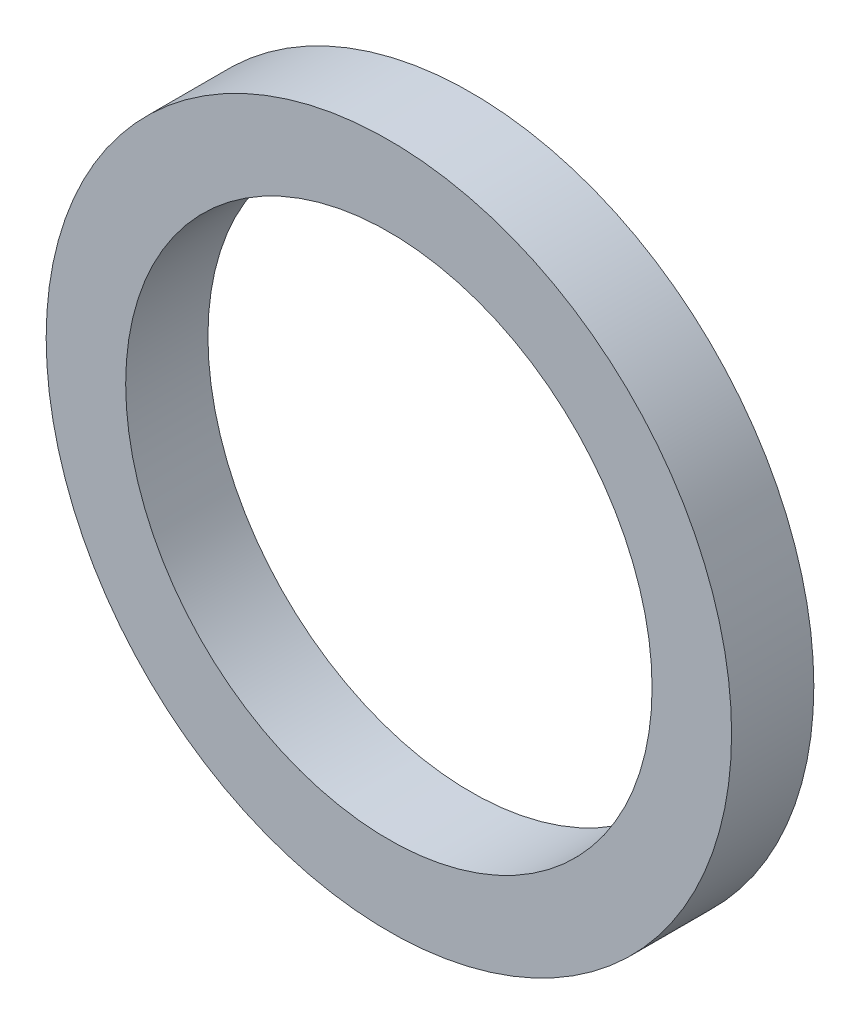
ISO-10303-21;
HEADER;
FILE_DESCRIPTION(('STEP AP214'),'2;1');
FILE_NAME('part.step','',(''),(''),'','','');
FILE_SCHEMA(('AUTOMOTIVE_DESIGN { 1 0 10303 214 1 1 1 1 }'));
ENDSEC;
DATA;
#1=APPLICATION_CONTEXT('core data for automotive mechanical design processes');
#2=APPLICATION_PROTOCOL_DEFINITION('international standard','automotive_design',2000,#1);
#3=PRODUCT_CONTEXT('',#1,'mechanical');
#4=PRODUCT('Part','Part','',(#3));
#5=PRODUCT_RELATED_PRODUCT_CATEGORY('part','',(#4));
#6=PRODUCT_DEFINITION_FORMATION('','',#4);
#7=PRODUCT_DEFINITION_CONTEXT('part definition',#1,'design');
#8=PRODUCT_DEFINITION('design','',#6,#7);
#9=PRODUCT_DEFINITION_SHAPE('','',#8);
#10=(LENGTH_UNIT() NAMED_UNIT(*) SI_UNIT(.MILLI.,.METRE.));
#11=(NAMED_UNIT(*) PLANE_ANGLE_UNIT() SI_UNIT($,.RADIAN.));
#12=(NAMED_UNIT(*) SI_UNIT($,.STERADIAN.) SOLID_ANGLE_UNIT());
#13=UNCERTAINTY_MEASURE_WITH_UNIT(LENGTH_MEASURE(1.E-05),#10,'distance_accuracy_value','');
#14=(GEOMETRIC_REPRESENTATION_CONTEXT(3) GLOBAL_UNCERTAINTY_ASSIGNED_CONTEXT((#13)) GLOBAL_UNIT_ASSIGNED_CONTEXT((#10,
#11,#12)) REPRESENTATION_CONTEXT('',''));
#15=CARTESIAN_POINT('',(0.,0.,0.));
#16=DIRECTION('',(0.,0.,1.));
#17=DIRECTION('',(1.,0.,0.));
#18=AXIS2_PLACEMENT_3D('',#15,#16,#17);
#19=CARTESIAN_POINT('',(0.,0.,7.62));
#20=DIRECTION('',(0.,0.,-1.));
#21=DIRECTION('',(-1.,0.,0.));
#22=AXIS2_PLACEMENT_3D('',#19,#20,#21);
#23=CYLINDRICAL_SURFACE('',#22,31.75);
#24=CARTESIAN_POINT('',(0.,0.,7.62));
#25=DIRECTION('',(0.,0.,1.));
#26=DIRECTION('',(1.,0.,0.));
#27=AXIS2_PLACEMENT_3D('',#24,#25,#26);
#28=CIRCLE('',#27,31.75);
#29=CARTESIAN_POINT('',(-31.75,0.,7.62));
#30=VERTEX_POINT('',#29);
#31=EDGE_CURVE('E10',#30,#30,#28,.T.);
#32=CARTESIAN_POINT('',(0.,0.,0.));
#33=DIRECTION('',(0.,0.,1.));
#34=DIRECTION('',(1.,0.,0.));
#35=AXIS2_PLACEMENT_3D('',#32,#33,#34);
#36=CIRCLE('',#35,31.75);
#37=CARTESIAN_POINT('',(-31.75,0.,0.));
#38=VERTEX_POINT('',#37);
#39=EDGE_CURVE('E34',#38,#38,#36,.T.);
#40=CARTESIAN_POINT('',(-31.75,0.,7.62));
#41=CARTESIAN_POINT('',(-31.75,0.,7.540625));
#42=CARTESIAN_POINT('',(-31.75,0.,7.46125));
#43=CARTESIAN_POINT('',(-31.75,0.,7.3025));
#44=CARTESIAN_POINT('',(-31.75,0.,7.223125));
#45=CARTESIAN_POINT('',(-31.75,0.,7.064375));
#46=CARTESIAN_POINT('',(-31.75,0.,6.985));
#47=CARTESIAN_POINT('',(-31.75,0.,6.82625));
#48=CARTESIAN_POINT('',(-31.75,0.,6.746875));
#49=CARTESIAN_POINT('',(-31.75,0.,6.588125));
#50=CARTESIAN_POINT('',(-31.75,0.,6.50875));
#51=CARTESIAN_POINT('',(-31.75,0.,6.35));
#52=CARTESIAN_POINT('',(-31.75,0.,6.270625));
#53=CARTESIAN_POINT('',(-31.75,0.,6.111875));
#54=CARTESIAN_POINT('',(-31.75,0.,6.0325));
#55=CARTESIAN_POINT('',(-31.75,0.,5.87375));
#56=CARTESIAN_POINT('',(-31.75,0.,5.794375));
#57=CARTESIAN_POINT('',(-31.75,0.,5.635625));
#58=CARTESIAN_POINT('',(-31.75,0.,5.55625));
#59=CARTESIAN_POINT('',(-31.75,0.,5.3975));
#60=CARTESIAN_POINT('',(-31.75,0.,5.318125));
#61=CARTESIAN_POINT('',(-31.75,0.,5.159375));
#62=CARTESIAN_POINT('',(-31.75,0.,5.08));
#63=CARTESIAN_POINT('',(-31.75,0.,4.92125));
#64=CARTESIAN_POINT('',(-31.75,0.,4.841875));
#65=CARTESIAN_POINT('',(-31.75,0.,4.683125));
#66=CARTESIAN_POINT('',(-31.75,0.,4.60375));
#67=CARTESIAN_POINT('',(-31.75,0.,4.445));
#68=CARTESIAN_POINT('',(-31.75,0.,4.365625));
#69=CARTESIAN_POINT('',(-31.75,0.,4.206875));
#70=CARTESIAN_POINT('',(-31.75,0.,4.1275));
#71=CARTESIAN_POINT('',(-31.75,0.,3.96875));
#72=CARTESIAN_POINT('',(-31.75,0.,3.889375));
#73=CARTESIAN_POINT('',(-31.75,0.,3.730625));
#74=CARTESIAN_POINT('',(-31.75,0.,3.65125));
#75=CARTESIAN_POINT('',(-31.75,0.,3.4925));
#76=CARTESIAN_POINT('',(-31.75,0.,3.413125));
#77=CARTESIAN_POINT('',(-31.75,0.,3.254375));
#78=CARTESIAN_POINT('',(-31.75,0.,3.175));
#79=CARTESIAN_POINT('',(-31.75,0.,3.01625));
#80=CARTESIAN_POINT('',(-31.75,0.,2.936875));
#81=CARTESIAN_POINT('',(-31.75,0.,2.778125));
#82=CARTESIAN_POINT('',(-31.75,0.,2.69875));
#83=CARTESIAN_POINT('',(-31.75,0.,2.54));
#84=CARTESIAN_POINT('',(-31.75,0.,2.460625));
#85=CARTESIAN_POINT('',(-31.75,0.,2.301875));
#86=CARTESIAN_POINT('',(-31.75,0.,2.2225));
#87=CARTESIAN_POINT('',(-31.75,0.,2.06375));
#88=CARTESIAN_POINT('',(-31.75,0.,1.984375));
#89=CARTESIAN_POINT('',(-31.75,0.,1.825625));
#90=CARTESIAN_POINT('',(-31.75,0.,1.74625));
#91=CARTESIAN_POINT('',(-31.75,0.,1.5875));
#92=CARTESIAN_POINT('',(-31.75,0.,1.508125));
#93=CARTESIAN_POINT('',(-31.75,0.,1.349375));
#94=CARTESIAN_POINT('',(-31.75,0.,1.27));
#95=CARTESIAN_POINT('',(-31.75,0.,1.11125));
#96=CARTESIAN_POINT('',(-31.75,0.,1.031875));
#97=CARTESIAN_POINT('',(-31.75,0.,0.873125));
#98=CARTESIAN_POINT('',(-31.75,0.,0.79375));
#99=CARTESIAN_POINT('',(-31.75,0.,0.635));
#100=CARTESIAN_POINT('',(-31.75,0.,0.555625));
#101=CARTESIAN_POINT('',(-31.75,0.,0.396875));
#102=CARTESIAN_POINT('',(-31.75,0.,0.3175));
#103=CARTESIAN_POINT('',(-31.75,0.,0.15875));
#104=CARTESIAN_POINT('',(-31.75,0.,0.0793749999999999));
#105=CARTESIAN_POINT('',(-31.75,0.,0.));
#106=B_SPLINE_CURVE_WITH_KNOTS('',3,(#40,#41,#42,#43,#44,#45,#46,#47,#48,#49,#50,#51,#52,#53,
#54,#55,#56,#57,#58,#59,#60,#61,#62,#63,#64,#65,#66,#67,#68,#69,#70,#71,#72,#73,#74,#75,#76,#77,
#78,#79,#80,#81,#82,#83,#84,#85,#86,#87,#88,#89,#90,#91,#92,#93,#94,#95,#96,#97,#98,#99,#100,
#101,#102,#103,#104,#105),.UNSPECIFIED.,.F.,.F.,(4,2,2,2,2,2,2,2,2,2,2,2,2,2,2,2,2,2,2,2,2,2,2,
2,2,2,2,2,2,2,2,2,4),(0.,0.238125,0.47625,0.714375000000001,0.9525,1.190625,1.42875,1.666875,
1.905,2.143125,2.38125,2.619375,2.8575,3.095625,3.33375,3.571875,3.81,4.048125,4.28625,4.524375,
4.7625,5.000625,5.23875,5.476875,5.715,5.953125,6.19125,6.429375,6.6675,6.905625,7.14375,
7.381875,7.62),.UNSPECIFIED.);
#107=EDGE_CURVE('BSEAM31',#30,#38,#106,.T.);
#108=ORIENTED_EDGE('',*,*,#31,.F.);
#109=ORIENTED_EDGE('',*,*,#39,.T.);
#110=ORIENTED_EDGE('',*,*,#107,.T.);
#111=ORIENTED_EDGE('',*,*,#107,.F.);
#112=EDGE_LOOP('',(#108,#110,#109,#111));
#113=FACE_BOUND('',#112,.T.);
#114=ADVANCED_FACE('F31',(#113),#23,.T.);
#115=CARTESIAN_POINT('',(0.,0.,7.62));
#116=DIRECTION('',(0.,0.,1.));
#117=DIRECTION('',(1.,0.,0.));
#118=AXIS2_PLACEMENT_3D('',#115,#116,#117);
#119=PLANE('',#118);
#120=CARTESIAN_POINT('',(0.,0.,7.62));
#121=DIRECTION('',(0.,0.,1.));
#122=DIRECTION('',(1.,0.,0.));
#123=AXIS2_PLACEMENT_3D('',#120,#121,#122);
#124=CIRCLE('',#123,24.384);
#125=CARTESIAN_POINT('',(24.384,0.,7.62));
#126=VERTEX_POINT('',#125);
#127=EDGE_CURVE('E43',#126,#126,#124,.T.);
#128=ORIENTED_EDGE('',*,*,#127,.F.);
#129=EDGE_LOOP('',(#128));
#130=FACE_BOUND('',#129,.T.);
#131=ORIENTED_EDGE('',*,*,#31,.T.);
#132=EDGE_LOOP('',(#131));
#133=FACE_BOUND('',#132,.T.);
#134=ADVANCED_FACE('F58',(#130,#133),#119,.T.);
#135=CARTESIAN_POINT('',(0.,0.,0.));
#136=DIRECTION('',(0.,0.,1.));
#137=DIRECTION('',(1.,0.,0.));
#138=AXIS2_PLACEMENT_3D('',#135,#136,#137);
#139=PLANE('',#138);
#140=CARTESIAN_POINT('',(0.,0.,0.));
#141=DIRECTION('',(0.,0.,1.));
#142=DIRECTION('',(1.,0.,0.));
#143=AXIS2_PLACEMENT_3D('',#140,#141,#142);
#144=CIRCLE('',#143,24.384);
#145=CARTESIAN_POINT('',(24.384,0.,0.));
#146=VERTEX_POINT('',#145);
#147=EDGE_CURVE('E41',#146,#146,#144,.T.);
#148=ORIENTED_EDGE('',*,*,#147,.T.);
#149=EDGE_LOOP('',(#148));
#150=FACE_BOUND('',#149,.T.);
#151=ORIENTED_EDGE('',*,*,#39,.F.);
#152=EDGE_LOOP('',(#151));
#153=FACE_BOUND('',#152,.T.);
#154=ADVANCED_FACE('F49',(#150,#153),#139,.F.);
#155=CARTESIAN_POINT('',(0.,0.,0.));
#156=DIRECTION('',(0.,0.,1.));
#157=DIRECTION('',(1.,0.,0.));
#158=AXIS2_PLACEMENT_3D('',#155,#156,#157);
#159=CYLINDRICAL_SURFACE('',#158,24.384);
#160=CARTESIAN_POINT('',(24.384,0.,0.));
#161=CARTESIAN_POINT('',(24.384,0.,0.0793749999999998));
#162=CARTESIAN_POINT('',(24.384,0.,0.15875));
#163=CARTESIAN_POINT('',(24.384,0.,0.3175));
#164=CARTESIAN_POINT('',(24.384,0.,0.396875));
#165=CARTESIAN_POINT('',(24.384,0.,0.555625));
#166=CARTESIAN_POINT('',(24.384,0.,0.635));
#167=CARTESIAN_POINT('',(24.384,0.,0.79375));
#168=CARTESIAN_POINT('',(24.384,0.,0.873125));
#169=CARTESIAN_POINT('',(24.384,0.,1.031875));
#170=CARTESIAN_POINT('',(24.384,0.,1.11125));
#171=CARTESIAN_POINT('',(24.384,0.,1.27));
#172=CARTESIAN_POINT('',(24.384,0.,1.349375));
#173=CARTESIAN_POINT('',(24.384,0.,1.508125));
#174=CARTESIAN_POINT('',(24.384,0.,1.5875));
#175=CARTESIAN_POINT('',(24.384,0.,1.74625));
#176=CARTESIAN_POINT('',(24.384,0.,1.825625));
#177=CARTESIAN_POINT('',(24.384,0.,1.984375));
#178=CARTESIAN_POINT('',(24.384,0.,2.06375));
#179=CARTESIAN_POINT('',(24.384,0.,2.2225));
#180=CARTESIAN_POINT('',(24.384,0.,2.301875));
#181=CARTESIAN_POINT('',(24.384,0.,2.460625));
#182=CARTESIAN_POINT('',(24.384,0.,2.54));
#183=CARTESIAN_POINT('',(24.384,0.,2.69875));
#184=CARTESIAN_POINT('',(24.384,0.,2.778125));
#185=CARTESIAN_POINT('',(24.384,0.,2.936875));
#186=CARTESIAN_POINT('',(24.384,0.,3.01625));
#187=CARTESIAN_POINT('',(24.384,0.,3.175));
#188=CARTESIAN_POINT('',(24.384,0.,3.254375));
#189=CARTESIAN_POINT('',(24.384,0.,3.413125));
#190=CARTESIAN_POINT('',(24.384,0.,3.4925));
#191=CARTESIAN_POINT('',(24.384,0.,3.65125));
#192=CARTESIAN_POINT('',(24.384,0.,3.730625));
#193=CARTESIAN_POINT('',(24.384,0.,3.889375));
#194=CARTESIAN_POINT('',(24.384,0.,3.96875));
#195=CARTESIAN_POINT('',(24.384,0.,4.1275));
#196=CARTESIAN_POINT('',(24.384,0.,4.206875));
#197=CARTESIAN_POINT('',(24.384,0.,4.365625));
#198=CARTESIAN_POINT('',(24.384,0.,4.445));
#199=CARTESIAN_POINT('',(24.384,0.,4.60375));
#200=CARTESIAN_POINT('',(24.384,0.,4.683125));
#201=CARTESIAN_POINT('',(24.384,0.,4.841875));
#202=CARTESIAN_POINT('',(24.384,0.,4.92125));
#203=CARTESIAN_POINT('',(24.384,0.,5.08));
#204=CARTESIAN_POINT('',(24.384,0.,5.159375));
#205=CARTESIAN_POINT('',(24.384,0.,5.318125));
#206=CARTESIAN_POINT('',(24.384,0.,5.3975));
#207=CARTESIAN_POINT('',(24.384,0.,5.55625));
#208=CARTESIAN_POINT('',(24.384,0.,5.635625));
#209=CARTESIAN_POINT('',(24.384,0.,5.794375));
#210=CARTESIAN_POINT('',(24.384,0.,5.87375));
#211=CARTESIAN_POINT('',(24.384,0.,6.0325));
#212=CARTESIAN_POINT('',(24.384,0.,6.111875));
#213=CARTESIAN_POINT('',(24.384,0.,6.270625));
#214=CARTESIAN_POINT('',(24.384,0.,6.35));
#215=CARTESIAN_POINT('',(24.384,0.,6.50875));
#216=CARTESIAN_POINT('',(24.384,0.,6.588125));
#217=CARTESIAN_POINT('',(24.384,0.,6.746875));
#218=CARTESIAN_POINT('',(24.384,0.,6.82625));
#219=CARTESIAN_POINT('',(24.384,0.,6.985));
#220=CARTESIAN_POINT('',(24.384,0.,7.064375));
#221=CARTESIAN_POINT('',(24.384,0.,7.223125));
#222=CARTESIAN_POINT('',(24.384,0.,7.3025));
#223=CARTESIAN_POINT('',(24.384,0.,7.46125));
#224=CARTESIAN_POINT('',(24.384,0.,7.540625));
#225=CARTESIAN_POINT('',(24.384,0.,7.62));
#226=B_SPLINE_CURVE_WITH_KNOTS('',3,(#160,#161,#162,#163,#164,#165,#166,#167,#168,#169,#170,
#171,#172,#173,#174,#175,#176,#177,#178,#179,#180,#181,#182,#183,#184,#185,#186,#187,#188,#189,
#190,#191,#192,#193,#194,#195,#196,#197,#198,#199,#200,#201,#202,#203,#204,#205,#206,#207,#208,
#209,#210,#211,#212,#213,#214,#215,#216,#217,#218,#219,#220,#221,#222,#223,#224,#225),
.UNSPECIFIED.,.F.,.F.,(4,2,2,2,2,2,2,2,2,2,2,2,2,2,2,2,2,2,2,2,2,2,2,2,2,2,2,2,2,2,2,2,4),(0.,
0.238125,0.47625,0.714375,0.9525,1.190625,1.42875,1.666875,1.905,2.143125,2.38125,2.619375,
2.8575,3.095625,3.33375,3.571875,3.81,4.048125,4.28625,4.524375,4.7625,5.000625,5.23875,
5.476875,5.715,5.953125,6.19125,6.429375,6.6675,6.905625,7.14375,7.381875,7.62),.UNSPECIFIED.);
#227=EDGE_CURVE('BSEAM52',#146,#126,#226,.T.);
#228=ORIENTED_EDGE('',*,*,#147,.F.);
#229=ORIENTED_EDGE('',*,*,#127,.T.);
#230=ORIENTED_EDGE('',*,*,#227,.T.);
#231=ORIENTED_EDGE('',*,*,#227,.F.);
#232=EDGE_LOOP('',(#228,#230,#229,#231));
#233=FACE_BOUND('',#232,.T.);
#234=ADVANCED_FACE('F52',(#233),#159,.F.);
#235=CLOSED_SHELL('',(#114,#134,#154,#234));
#236=MANIFOLD_SOLID_BREP('B2',#235);
#237=ADVANCED_BREP_SHAPE_REPRESENTATION('',(#18,#236),#14);
#238=SHAPE_DEFINITION_REPRESENTATION(#9,#237);
ENDSEC;
END-ISO-10303-21;
